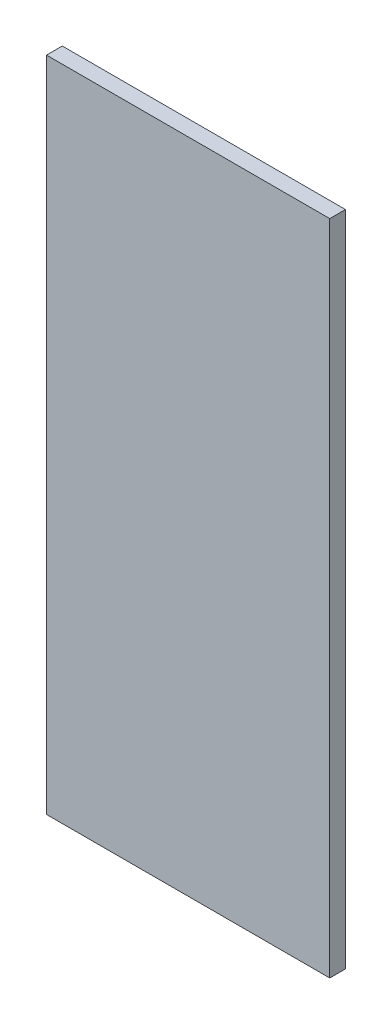
ISO-10303-21;
HEADER;
FILE_DESCRIPTION(('STEP AP214'),'2;1');
FILE_NAME('part.step','',(''),(''),'','','');
FILE_SCHEMA(('AUTOMOTIVE_DESIGN { 1 0 10303 214 1 1 1 1 }'));
ENDSEC;
DATA;
#1=APPLICATION_CONTEXT('core data for automotive mechanical design processes');
#2=APPLICATION_PROTOCOL_DEFINITION('international standard','automotive_design',2000,#1);
#3=PRODUCT_CONTEXT('',#1,'mechanical');
#4=PRODUCT('Part','Part','',(#3));
#5=PRODUCT_RELATED_PRODUCT_CATEGORY('part','',(#4));
#6=PRODUCT_DEFINITION_FORMATION('','',#4);
#7=PRODUCT_DEFINITION_CONTEXT('part definition',#1,'design');
#8=PRODUCT_DEFINITION('design','',#6,#7);
#9=PRODUCT_DEFINITION_SHAPE('','',#8);
#10=(LENGTH_UNIT() NAMED_UNIT(*) SI_UNIT(.MILLI.,.METRE.));
#11=(NAMED_UNIT(*) PLANE_ANGLE_UNIT() SI_UNIT($,.RADIAN.));
#12=(NAMED_UNIT(*) SI_UNIT($,.STERADIAN.) SOLID_ANGLE_UNIT());
#13=UNCERTAINTY_MEASURE_WITH_UNIT(LENGTH_MEASURE(1.E-05),#10,'distance_accuracy_value','');
#14=(GEOMETRIC_REPRESENTATION_CONTEXT(3) GLOBAL_UNCERTAINTY_ASSIGNED_CONTEXT((#13)) GLOBAL_UNIT_ASSIGNED_CONTEXT((#10,
#11,#12)) REPRESENTATION_CONTEXT('',''));
#15=CARTESIAN_POINT('',(0.,0.,0.));
#16=DIRECTION('',(0.,0.,1.));
#17=DIRECTION('',(1.,0.,0.));
#18=AXIS2_PLACEMENT_3D('',#15,#16,#17);
#19=CARTESIAN_POINT('',(0.,0.,50.));
#20=DIRECTION('',(-1.,0.,0.));
#21=DIRECTION('',(0.,0.,1.));
#22=AXIS2_PLACEMENT_3D('',#19,#20,#21);
#23=PLANE('',#22);
#24=DIRECTION('',(0.,1.,0.));
#25=VECTOR('',#24,1.);
#26=CARTESIAN_POINT('',(0.,0.,0.));
#27=LINE('',#26,#25);
#28=CARTESIAN_POINT('',(0.,0.,0.));
#29=VERTEX_POINT('',#28);
#30=CARTESIAN_POINT('',(0.,2090.,0.));
#31=VERTEX_POINT('',#30);
#32=EDGE_CURVE('E99',#29,#31,#27,.T.);
#33=ORIENTED_EDGE('',*,*,#32,.T.);
#34=DIRECTION('',(0.,0.,-1.));
#35=VECTOR('',#34,1.);
#36=CARTESIAN_POINT('',(0.,2090.,50.));
#37=LINE('',#36,#35);
#38=CARTESIAN_POINT('',(0.,2090.,50.));
#39=VERTEX_POINT('',#38);
#40=EDGE_CURVE('E11',#39,#31,#37,.T.);
#41=ORIENTED_EDGE('',*,*,#40,.F.);
#42=DIRECTION('',(0.,1.,0.));
#43=VECTOR('',#42,1.);
#44=CARTESIAN_POINT('',(0.,0.,50.));
#45=LINE('',#44,#43);
#46=CARTESIAN_POINT('',(0.,0.,50.));
#47=VERTEX_POINT('',#46);
#48=EDGE_CURVE('E87',#47,#39,#45,.T.);
#49=ORIENTED_EDGE('',*,*,#48,.F.);
#50=DIRECTION('',(0.,0.,-1.));
#51=VECTOR('',#50,1.);
#52=CARTESIAN_POINT('',(0.,0.,50.));
#53=LINE('',#52,#51);
#54=EDGE_CURVE('E95',#47,#29,#53,.T.);
#55=ORIENTED_EDGE('',*,*,#54,.T.);
#56=EDGE_LOOP('',(#33,#41,#49,#55));
#57=FACE_BOUND('',#56,.T.);
#58=ADVANCED_FACE('F36',(#57),#23,.F.);
#59=CARTESIAN_POINT('',(0.,2090.,50.));
#60=DIRECTION('',(0.,-1.,0.));
#61=DIRECTION('',(0.,0.,-1.));
#62=AXIS2_PLACEMENT_3D('',#59,#60,#61);
#63=PLANE('',#62);
#64=DIRECTION('',(-1.,0.,0.));
#65=VECTOR('',#64,1.);
#66=CARTESIAN_POINT('',(0.,2090.,0.));
#67=LINE('',#66,#65);
#68=CARTESIAN_POINT('',(-900.,2090.,0.));
#69=VERTEX_POINT('',#68);
#70=EDGE_CURVE('E91',#31,#69,#67,.T.);
#71=ORIENTED_EDGE('',*,*,#70,.T.);
#72=DIRECTION('',(0.,0.,-1.));
#73=VECTOR('',#72,1.);
#74=CARTESIAN_POINT('',(-900.,2090.,50.));
#75=LINE('',#74,#73);
#76=CARTESIAN_POINT('',(-900.,2090.,50.));
#77=VERTEX_POINT('',#76);
#78=EDGE_CURVE('E44',#77,#69,#75,.T.);
#79=ORIENTED_EDGE('',*,*,#78,.F.);
#80=DIRECTION('',(-1.,0.,0.));
#81=VECTOR('',#80,1.);
#82=CARTESIAN_POINT('',(0.,2090.,50.));
#83=LINE('',#82,#81);
#84=EDGE_CURVE('E82',#39,#77,#83,.T.);
#85=ORIENTED_EDGE('',*,*,#84,.F.);
#86=ORIENTED_EDGE('',*,*,#40,.T.);
#87=EDGE_LOOP('',(#71,#79,#85,#86));
#88=FACE_BOUND('',#87,.T.);
#89=ADVANCED_FACE('F90',(#88),#63,.F.);
#90=CARTESIAN_POINT('',(-900.,-2.14241963617868E-13,50.));
#91=DIRECTION('',(1.,0.,0.));
#92=DIRECTION('',(0.,1.,0.));
#93=AXIS2_PLACEMENT_3D('',#90,#91,#92);
#94=PLANE('',#93);
#95=DIRECTION('',(0.,-1.,0.));
#96=VECTOR('',#95,1.);
#97=CARTESIAN_POINT('',(-900.,-2.14241963617868E-13,0.));
#98=LINE('',#97,#96);
#99=CARTESIAN_POINT('',(-900.,-2.14241963617868E-13,0.));
#100=VERTEX_POINT('',#99);
#101=EDGE_CURVE('E69',#69,#100,#98,.T.);
#102=ORIENTED_EDGE('',*,*,#101,.T.);
#103=DIRECTION('',(0.,0.,-1.));
#104=VECTOR('',#103,1.);
#105=CARTESIAN_POINT('',(-900.,-2.14241963617868E-13,50.));
#106=LINE('',#105,#104);
#107=CARTESIAN_POINT('',(-900.,-2.14241963617868E-13,50.));
#108=VERTEX_POINT('',#107);
#109=EDGE_CURVE('E92',#108,#100,#106,.T.);
#110=ORIENTED_EDGE('',*,*,#109,.F.);
#111=DIRECTION('',(0.,-1.,0.));
#112=VECTOR('',#111,1.);
#113=CARTESIAN_POINT('',(-900.,-2.14241963617868E-13,50.));
#114=LINE('',#113,#112);
#115=EDGE_CURVE('E85',#77,#108,#114,.T.);
#116=ORIENTED_EDGE('',*,*,#115,.F.);
#117=ORIENTED_EDGE('',*,*,#78,.T.);
#118=EDGE_LOOP('',(#102,#110,#116,#117));
#119=FACE_BOUND('',#118,.T.);
#120=ADVANCED_FACE('F93',(#119),#94,.F.);
#121=CARTESIAN_POINT('',(0.,0.,50.));
#122=DIRECTION('',(0.,1.,0.));
#123=DIRECTION('',(-1.,0.,0.));
#124=AXIS2_PLACEMENT_3D('',#121,#122,#123);
#125=PLANE('',#124);
#126=DIRECTION('',(1.,0.,0.));
#127=VECTOR('',#126,1.);
#128=CARTESIAN_POINT('',(0.,0.,0.));
#129=LINE('',#128,#127);
#130=EDGE_CURVE('E75',#100,#29,#129,.T.);
#131=ORIENTED_EDGE('',*,*,#130,.T.);
#132=ORIENTED_EDGE('',*,*,#54,.F.);
#133=DIRECTION('',(1.,0.,0.));
#134=VECTOR('',#133,1.);
#135=CARTESIAN_POINT('',(0.,0.,50.));
#136=LINE('',#135,#134);
#137=EDGE_CURVE('E52',#108,#47,#136,.T.);
#138=ORIENTED_EDGE('',*,*,#137,.F.);
#139=ORIENTED_EDGE('',*,*,#109,.T.);
#140=EDGE_LOOP('',(#131,#132,#138,#139));
#141=FACE_BOUND('',#140,.T.);
#142=ADVANCED_FACE('F106',(#141),#125,.F.);
#143=CARTESIAN_POINT('',(0.,0.,50.));
#144=DIRECTION('',(0.,0.,1.));
#145=DIRECTION('',(1.,0.,0.));
#146=AXIS2_PLACEMENT_3D('',#143,#144,#145);
#147=PLANE('',#146);
#148=ORIENTED_EDGE('',*,*,#48,.T.);
#149=ORIENTED_EDGE('',*,*,#84,.T.);
#150=ORIENTED_EDGE('',*,*,#115,.T.);
#151=ORIENTED_EDGE('',*,*,#137,.T.);
#152=EDGE_LOOP('',(#148,#149,#150,#151));
#153=FACE_BOUND('',#152,.T.);
#154=ADVANCED_FACE('F83',(#153),#147,.T.);
#155=CARTESIAN_POINT('',(0.,0.,0.));
#156=DIRECTION('',(0.,0.,1.));
#157=DIRECTION('',(1.,0.,0.));
#158=AXIS2_PLACEMENT_3D('',#155,#156,#157);
#159=PLANE('',#158);
#160=ORIENTED_EDGE('',*,*,#32,.F.);
#161=ORIENTED_EDGE('',*,*,#130,.F.);
#162=ORIENTED_EDGE('',*,*,#101,.F.);
#163=ORIENTED_EDGE('',*,*,#70,.F.);
#164=EDGE_LOOP('',(#160,#161,#162,#163));
#165=FACE_BOUND('',#164,.T.);
#166=ADVANCED_FACE('F109',(#165),#159,.F.);
#167=CLOSED_SHELL('',(#58,#89,#120,#142,#154,#166));
#168=MANIFOLD_SOLID_BREP('B2',#167);
#169=ADVANCED_BREP_SHAPE_REPRESENTATION('',(#18,#168),#14);
#170=SHAPE_DEFINITION_REPRESENTATION(#9,#169);
ENDSEC;
END-ISO-10303-21;
